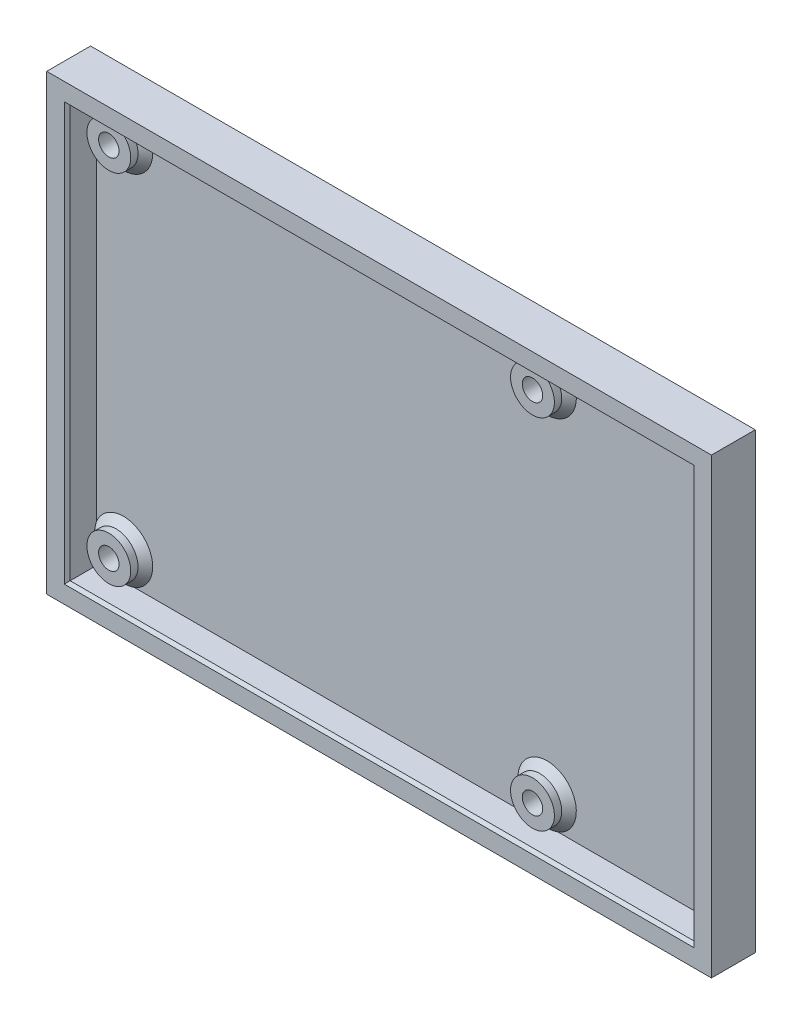
ISO-10303-21;
HEADER;
FILE_DESCRIPTION(('STEP AP214'),'2;1');
FILE_NAME('part.step','',(''),(''),'','','');
FILE_SCHEMA(('AUTOMOTIVE_DESIGN { 1 0 10303 214 1 1 1 1 }'));
ENDSEC;
DATA;
#1=APPLICATION_CONTEXT('core data for automotive mechanical design processes');
#2=APPLICATION_PROTOCOL_DEFINITION('international standard','automotive_design',2000,#1);
#3=PRODUCT_CONTEXT('',#1,'mechanical');
#4=PRODUCT('Part','Part','',(#3));
#5=PRODUCT_RELATED_PRODUCT_CATEGORY('part','',(#4));
#6=PRODUCT_DEFINITION_FORMATION('','',#4);
#7=PRODUCT_DEFINITION_CONTEXT('part definition',#1,'design');
#8=PRODUCT_DEFINITION('design','',#6,#7);
#9=PRODUCT_DEFINITION_SHAPE('','',#8);
#10=(LENGTH_UNIT() NAMED_UNIT(*) SI_UNIT(.MILLI.,.METRE.));
#11=(NAMED_UNIT(*) PLANE_ANGLE_UNIT() SI_UNIT($,.RADIAN.));
#12=(NAMED_UNIT(*) SI_UNIT($,.STERADIAN.) SOLID_ANGLE_UNIT());
#13=UNCERTAINTY_MEASURE_WITH_UNIT(LENGTH_MEASURE(1.E-05),#10,'distance_accuracy_value','');
#14=(GEOMETRIC_REPRESENTATION_CONTEXT(3) GLOBAL_UNCERTAINTY_ASSIGNED_CONTEXT((#13)) GLOBAL_UNIT_ASSIGNED_CONTEXT((#10,
#11,#12)) REPRESENTATION_CONTEXT('',''));
#15=CARTESIAN_POINT('',(0.,0.,0.));
#16=DIRECTION('',(0.,0.,1.));
#17=DIRECTION('',(1.,0.,0.));
#18=AXIS2_PLACEMENT_3D('',#15,#16,#17);
#19=CARTESIAN_POINT('',(0.,0.,2.));
#20=DIRECTION('',(0.,0.,-1.));
#21=DIRECTION('',(-1.,0.,0.));
#22=AXIS2_PLACEMENT_3D('',#19,#20,#21);
#23=PLANE('',#22);
#24=DIRECTION('',(1.,0.,0.));
#25=VECTOR('',#24,1.);
#26=CARTESIAN_POINT('',(-42.7,-28.2,2.));
#27=LINE('',#26,#25);
#28=CARTESIAN_POINT('',(-42.7,-28.2,2.));
#29=VERTEX_POINT('',#28);
#30=CARTESIAN_POINT('',(-40.519868415357,-28.2,2.));
#31=VERTEX_POINT('',#30);
#32=EDGE_CURVE('E174',#29,#31,#27,.T.);
#33=ORIENTED_EDGE('',*,*,#32,.T.);
#34=CARTESIAN_POINT('',(-39.,-24.5,2.));
#35=DIRECTION('',(0.,0.,-1.));
#36=DIRECTION('',(-1.,0.,0.));
#37=AXIS2_PLACEMENT_3D('',#34,#35,#36);
#38=CIRCLE('',#37,3.99999999999999);
#39=CARTESIAN_POINT('',(-42.7,-26.019868415357,2.));
#40=VERTEX_POINT('',#39);
#41=EDGE_CURVE('E290',#31,#40,#38,.T.);
#42=ORIENTED_EDGE('',*,*,#41,.T.);
#43=DIRECTION('',(0.,-1.,0.));
#44=VECTOR('',#43,1.);
#45=CARTESIAN_POINT('',(-42.7,-28.2,2.));
#46=LINE('',#45,#44);
#47=EDGE_CURVE('E184',#40,#29,#46,.T.);
#48=ORIENTED_EDGE('',*,*,#47,.T.);
#49=EDGE_LOOP('',(#33,#42,#48));
#50=FACE_BOUND('',#49,.T.);
#51=ADVANCED_FACE('F45',(#50),#23,.F.);
#52=CARTESIAN_POINT('',(-37.4801315846429,-28.2,2.));
#53=VERTEX_POINT('',#52);
#54=CARTESIAN_POINT('',(17.4801315846429,-28.2,2.));
#55=VERTEX_POINT('',#54);
#56=EDGE_CURVE('E204',#53,#55,#27,.T.);
#57=ORIENTED_EDGE('',*,*,#56,.T.);
#58=CARTESIAN_POINT('',(19.,-24.5,2.));
#59=DIRECTION('',(0.,0.,-1.));
#60=DIRECTION('',(-1.,0.,0.));
#61=AXIS2_PLACEMENT_3D('',#58,#59,#60);
#62=CIRCLE('',#61,4.);
#63=CARTESIAN_POINT('',(20.5198684153571,-28.2,2.));
#64=VERTEX_POINT('',#63);
#65=EDGE_CURVE('E60',#55,#64,#62,.T.);
#66=ORIENTED_EDGE('',*,*,#65,.T.);
#67=CARTESIAN_POINT('',(42.7,-28.2,2.));
#68=VERTEX_POINT('',#67);
#69=EDGE_CURVE('E189',#64,#68,#27,.T.);
#70=ORIENTED_EDGE('',*,*,#69,.T.);
#71=DIRECTION('',(0.,1.,0.));
#72=VECTOR('',#71,1.);
#73=CARTESIAN_POINT('',(42.7,-28.2,2.));
#74=LINE('',#73,#72);
#75=CARTESIAN_POINT('',(42.7,28.2,2.));
#76=VERTEX_POINT('',#75);
#77=EDGE_CURVE('E168',#68,#76,#74,.T.);
#78=ORIENTED_EDGE('',*,*,#77,.T.);
#79=DIRECTION('',(-1.,0.,0.));
#80=VECTOR('',#79,1.);
#81=CARTESIAN_POINT('',(-42.7,28.2,2.));
#82=LINE('',#81,#80);
#83=CARTESIAN_POINT('',(20.5198684153571,28.2,2.));
#84=VERTEX_POINT('',#83);
#85=EDGE_CURVE('E177',#76,#84,#82,.T.);
#86=ORIENTED_EDGE('',*,*,#85,.T.);
#87=CARTESIAN_POINT('',(19.,24.5,2.));
#88=DIRECTION('',(0.,0.,-1.));
#89=DIRECTION('',(-1.,0.,0.));
#90=AXIS2_PLACEMENT_3D('',#87,#88,#89);
#91=CIRCLE('',#90,4.);
#92=CARTESIAN_POINT('',(17.4801315846429,28.2,2.));
#93=VERTEX_POINT('',#92);
#94=EDGE_CURVE('E326',#84,#93,#91,.T.);
#95=ORIENTED_EDGE('',*,*,#94,.T.);
#96=CARTESIAN_POINT('',(-37.4801315846429,28.2,2.));
#97=VERTEX_POINT('',#96);
#98=EDGE_CURVE('E185',#93,#97,#82,.T.);
#99=ORIENTED_EDGE('',*,*,#98,.T.);
#100=CARTESIAN_POINT('',(-39.,24.5,2.));
#101=DIRECTION('',(0.,0.,-1.));
#102=DIRECTION('',(-1.,0.,0.));
#103=AXIS2_PLACEMENT_3D('',#100,#101,#102);
#104=CIRCLE('',#103,3.99999999999999);
#105=CARTESIAN_POINT('',(-42.7,22.980131584643,2.));
#106=VERTEX_POINT('',#105);
#107=EDGE_CURVE('E247',#97,#106,#104,.T.);
#108=ORIENTED_EDGE('',*,*,#107,.T.);
#109=CARTESIAN_POINT('',(-42.7,-22.980131584643,2.));
#110=VERTEX_POINT('',#109);
#111=EDGE_CURVE('E201',#106,#110,#46,.T.);
#112=ORIENTED_EDGE('',*,*,#111,.T.);
#113=CARTESIAN_POINT('',(-39.,-24.5,2.));
#114=DIRECTION('',(0.,0.,-1.));
#115=DIRECTION('',(-1.,0.,0.));
#116=AXIS2_PLACEMENT_3D('',#113,#114,#115);
#117=CIRCLE('',#116,3.99999999999999);
#118=EDGE_CURVE('E365',#110,#53,#117,.T.);
#119=ORIENTED_EDGE('',*,*,#118,.T.);
#120=EDGE_LOOP('',(#57,#66,#70,#78,#86,#95,#99,#108,#112,#119));
#121=FACE_BOUND('',#120,.T.);
#122=ADVANCED_FACE('F188',(#121),#23,.F.);
#123=CARTESIAN_POINT('',(45.5,-31.,6.));
#124=DIRECTION('',(-1.,0.,0.));
#125=DIRECTION('',(0.,0.,1.));
#126=AXIS2_PLACEMENT_3D('',#123,#124,#125);
#127=PLANE('',#126);
#128=DIRECTION('',(0.,1.,0.));
#129=VECTOR('',#128,1.);
#130=CARTESIAN_POINT('',(45.5,-31.,0.));
#131=LINE('',#130,#129);
#132=CARTESIAN_POINT('',(45.5,-31.,0.));
#133=VERTEX_POINT('',#132);
#134=CARTESIAN_POINT('',(45.5,31.,0.));
#135=VERTEX_POINT('',#134);
#136=EDGE_CURVE('E207',#133,#135,#131,.T.);
#137=ORIENTED_EDGE('',*,*,#136,.T.);
#138=DIRECTION('',(0.,0.,-1.));
#139=VECTOR('',#138,1.);
#140=CARTESIAN_POINT('',(45.5,31.,6.));
#141=LINE('',#140,#139);
#142=CARTESIAN_POINT('',(45.5,31.,6.));
#143=VERTEX_POINT('',#142);
#144=EDGE_CURVE('E239',#143,#135,#141,.T.);
#145=ORIENTED_EDGE('',*,*,#144,.F.);
#146=DIRECTION('',(0.,1.,0.));
#147=VECTOR('',#146,1.);
#148=CARTESIAN_POINT('',(45.5,-31.,6.));
#149=LINE('',#148,#147);
#150=CARTESIAN_POINT('',(45.5,-31.,6.));
#151=VERTEX_POINT('',#150);
#152=EDGE_CURVE('E213',#151,#143,#149,.T.);
#153=ORIENTED_EDGE('',*,*,#152,.F.);
#154=DIRECTION('',(0.,0.,-1.));
#155=VECTOR('',#154,1.);
#156=CARTESIAN_POINT('',(45.5,-31.,6.));
#157=LINE('',#156,#155);
#158=EDGE_CURVE('E223',#151,#133,#157,.T.);
#159=ORIENTED_EDGE('',*,*,#158,.T.);
#160=EDGE_LOOP('',(#137,#145,#153,#159));
#161=FACE_BOUND('',#160,.T.);
#162=ADVANCED_FACE('F416',(#161),#127,.F.);
#163=CARTESIAN_POINT('',(-45.5,31.,6.));
#164=DIRECTION('',(0.,-1.,0.));
#165=DIRECTION('',(0.,0.,-1.));
#166=AXIS2_PLACEMENT_3D('',#163,#164,#165);
#167=PLANE('',#166);
#168=DIRECTION('',(-1.,0.,0.));
#169=VECTOR('',#168,1.);
#170=CARTESIAN_POINT('',(-45.5,31.,0.));
#171=LINE('',#170,#169);
#172=CARTESIAN_POINT('',(-45.5,31.,0.));
#173=VERTEX_POINT('',#172);
#174=EDGE_CURVE('E226',#135,#173,#171,.T.);
#175=ORIENTED_EDGE('',*,*,#174,.T.);
#176=DIRECTION('',(0.,0.,-1.));
#177=VECTOR('',#176,1.);
#178=CARTESIAN_POINT('',(-45.5,31.,6.));
#179=LINE('',#178,#177);
#180=CARTESIAN_POINT('',(-45.5,31.,6.));
#181=VERTEX_POINT('',#180);
#182=EDGE_CURVE('E236',#181,#173,#179,.T.);
#183=ORIENTED_EDGE('',*,*,#182,.F.);
#184=DIRECTION('',(-1.,0.,0.));
#185=VECTOR('',#184,1.);
#186=CARTESIAN_POINT('',(-45.5,31.,6.));
#187=LINE('',#186,#185);
#188=EDGE_CURVE('E216',#143,#181,#187,.T.);
#189=ORIENTED_EDGE('',*,*,#188,.F.);
#190=ORIENTED_EDGE('',*,*,#144,.T.);
#191=EDGE_LOOP('',(#175,#183,#189,#190));
#192=FACE_BOUND('',#191,.T.);
#193=ADVANCED_FACE('F419',(#192),#167,.F.);
#194=CARTESIAN_POINT('',(-45.5,-31.,6.));
#195=DIRECTION('',(1.,0.,0.));
#196=DIRECTION('',(0.,0.,-1.));
#197=AXIS2_PLACEMENT_3D('',#194,#195,#196);
#198=PLANE('',#197);
#199=DIRECTION('',(0.,-1.,0.));
#200=VECTOR('',#199,1.);
#201=CARTESIAN_POINT('',(-45.5,-31.,0.));
#202=LINE('',#201,#200);
#203=CARTESIAN_POINT('',(-45.5,-31.,0.));
#204=VERTEX_POINT('',#203);
#205=EDGE_CURVE('E228',#173,#204,#202,.T.);
#206=ORIENTED_EDGE('',*,*,#205,.T.);
#207=DIRECTION('',(0.,0.,-1.));
#208=VECTOR('',#207,1.);
#209=CARTESIAN_POINT('',(-45.5,-31.,6.));
#210=LINE('',#209,#208);
#211=CARTESIAN_POINT('',(-45.5,-31.,6.));
#212=VERTEX_POINT('',#211);
#213=EDGE_CURVE('E233',#212,#204,#210,.T.);
#214=ORIENTED_EDGE('',*,*,#213,.F.);
#215=DIRECTION('',(0.,-1.,0.));
#216=VECTOR('',#215,1.);
#217=CARTESIAN_POINT('',(-45.5,-31.,6.));
#218=LINE('',#217,#216);
#219=EDGE_CURVE('E219',#181,#212,#218,.T.);
#220=ORIENTED_EDGE('',*,*,#219,.F.);
#221=ORIENTED_EDGE('',*,*,#182,.T.);
#222=EDGE_LOOP('',(#206,#214,#220,#221));
#223=FACE_BOUND('',#222,.T.);
#224=ADVANCED_FACE('F424',(#223),#198,.F.);
#225=CARTESIAN_POINT('',(-45.5,-31.,6.));
#226=DIRECTION('',(0.,1.,0.));
#227=DIRECTION('',(0.,0.,1.));
#228=AXIS2_PLACEMENT_3D('',#225,#226,#227);
#229=PLANE('',#228);
#230=DIRECTION('',(1.,0.,0.));
#231=VECTOR('',#230,1.);
#232=CARTESIAN_POINT('',(-45.5,-31.,0.));
#233=LINE('',#232,#231);
#234=EDGE_CURVE('E217',#204,#133,#233,.T.);
#235=ORIENTED_EDGE('',*,*,#234,.T.);
#236=ORIENTED_EDGE('',*,*,#158,.F.);
#237=DIRECTION('',(1.,0.,0.));
#238=VECTOR('',#237,1.);
#239=CARTESIAN_POINT('',(-45.5,-31.,6.));
#240=LINE('',#239,#238);
#241=EDGE_CURVE('E221',#212,#151,#240,.T.);
#242=ORIENTED_EDGE('',*,*,#241,.F.);
#243=ORIENTED_EDGE('',*,*,#213,.T.);
#244=EDGE_LOOP('',(#235,#236,#242,#243));
#245=FACE_BOUND('',#244,.T.);
#246=ADVANCED_FACE('F408',(#245),#229,.F.);
#247=CARTESIAN_POINT('',(0.,0.,6.));
#248=DIRECTION('',(0.,0.,-1.));
#249=DIRECTION('',(-1.,0.,0.));
#250=AXIS2_PLACEMENT_3D('',#247,#248,#249);
#251=PLANE('',#250);
#252=DIRECTION('',(0.,-1.,0.));
#253=VECTOR('',#252,1.);
#254=CARTESIAN_POINT('',(43.1,0.,6.));
#255=LINE('',#254,#253);
#256=CARTESIAN_POINT('',(43.1,28.6,6.));
#257=VERTEX_POINT('',#256);
#258=CARTESIAN_POINT('',(43.1,-28.6,6.));
#259=VERTEX_POINT('',#258);
#260=EDGE_CURVE('E341',#257,#259,#255,.T.);
#261=ORIENTED_EDGE('',*,*,#260,.T.);
#262=DIRECTION('',(-1.,0.,0.));
#263=VECTOR('',#262,1.);
#264=CARTESIAN_POINT('',(0.,-28.6,6.));
#265=LINE('',#264,#263);
#266=CARTESIAN_POINT('',(-43.1,-28.6,6.));
#267=VERTEX_POINT('',#266);
#268=EDGE_CURVE('E343',#259,#267,#265,.T.);
#269=ORIENTED_EDGE('',*,*,#268,.T.);
#270=DIRECTION('',(0.,1.,0.));
#271=VECTOR('',#270,1.);
#272=CARTESIAN_POINT('',(-43.1,0.,6.));
#273=LINE('',#272,#271);
#274=CARTESIAN_POINT('',(-43.1,28.6,6.));
#275=VERTEX_POINT('',#274);
#276=EDGE_CURVE('E336',#267,#275,#273,.T.);
#277=ORIENTED_EDGE('',*,*,#276,.T.);
#278=DIRECTION('',(1.,0.,0.));
#279=VECTOR('',#278,1.);
#280=CARTESIAN_POINT('',(0.,28.6,6.));
#281=LINE('',#280,#279);
#282=EDGE_CURVE('E335',#275,#257,#281,.T.);
#283=ORIENTED_EDGE('',*,*,#282,.T.);
#284=EDGE_LOOP('',(#261,#269,#277,#283));
#285=FACE_BOUND('',#284,.T.);
#286=ORIENTED_EDGE('',*,*,#152,.T.);
#287=ORIENTED_EDGE('',*,*,#188,.T.);
#288=ORIENTED_EDGE('',*,*,#219,.T.);
#289=ORIENTED_EDGE('',*,*,#241,.T.);
#290=EDGE_LOOP('',(#286,#287,#288,#289));
#291=FACE_BOUND('',#290,.T.);
#292=ADVANCED_FACE('F404',(#285,#291),#251,.F.);
#293=CARTESIAN_POINT('',(0.,0.,0.));
#294=DIRECTION('',(0.,0.,-1.));
#295=DIRECTION('',(-1.,0.,0.));
#296=AXIS2_PLACEMENT_3D('',#293,#294,#295);
#297=PLANE('',#296);
#298=ORIENTED_EDGE('',*,*,#136,.F.);
#299=ORIENTED_EDGE('',*,*,#234,.F.);
#300=ORIENTED_EDGE('',*,*,#205,.F.);
#301=ORIENTED_EDGE('',*,*,#174,.F.);
#302=EDGE_LOOP('',(#298,#299,#300,#301));
#303=FACE_BOUND('',#302,.T.);
#304=ADVANCED_FACE('F407',(#303),#297,.T.);
#305=CARTESIAN_POINT('',(42.7,-28.2,2.));
#306=DIRECTION('',(1.,0.,0.));
#307=DIRECTION('',(0.,0.,-1.));
#308=AXIS2_PLACEMENT_3D('',#305,#306,#307);
#309=PLANE('',#308);
#310=DIRECTION('',(0.,0.,1.));
#311=VECTOR('',#310,1.);
#312=CARTESIAN_POINT('',(42.7,-28.2,2.));
#313=LINE('',#312,#311);
#314=CARTESIAN_POINT('',(42.7,-28.2,5.59999999999999));
#315=VERTEX_POINT('',#314);
#316=EDGE_CURVE('E205',#68,#315,#313,.T.);
#317=ORIENTED_EDGE('',*,*,#316,.T.);
#318=DIRECTION('',(0.,1.,0.));
#319=VECTOR('',#318,1.);
#320=CARTESIAN_POINT('',(42.7,-28.2,5.59999999999999));
#321=LINE('',#320,#319);
#322=CARTESIAN_POINT('',(42.7,28.2,5.59999999999999));
#323=VERTEX_POINT('',#322);
#324=EDGE_CURVE('E170',#315,#323,#321,.T.);
#325=ORIENTED_EDGE('',*,*,#324,.T.);
#326=DIRECTION('',(0.,0.,1.));
#327=VECTOR('',#326,1.);
#328=CARTESIAN_POINT('',(42.7,28.2,2.));
#329=LINE('',#328,#327);
#330=EDGE_CURVE('E163',#76,#323,#329,.T.);
#331=ORIENTED_EDGE('',*,*,#330,.F.);
#332=ORIENTED_EDGE('',*,*,#77,.F.);
#333=EDGE_LOOP('',(#317,#325,#331,#332));
#334=FACE_BOUND('',#333,.T.);
#335=ADVANCED_FACE('F166',(#334),#309,.F.);
#336=CARTESIAN_POINT('',(-42.7,-28.2,2.));
#337=DIRECTION('',(0.,-1.,0.));
#338=DIRECTION('',(0.,0.,-1.));
#339=AXIS2_PLACEMENT_3D('',#336,#337,#338);
#340=PLANE('',#339);
#341=ORIENTED_EDGE('',*,*,#69,.F.);
#342=CARTESIAN_POINT('',(20.5198684153571,-28.2,2.));
#343=CARTESIAN_POINT('',(20.3996159975398,-28.2,2.0457209328995));
#344=CARTESIAN_POINT('',(20.2776757720313,-28.2,2.0873905536171));
#345=CARTESIAN_POINT('',(20.0305523132339,-28.2,2.16096980399327));
#346=CARTESIAN_POINT('',(19.9053612967029,-28.2,2.19285310163561));
#347=CARTESIAN_POINT('',(19.6570616577513,-28.2,2.24400302894858));
#348=CARTESIAN_POINT('',(19.5340400474862,-28.2,2.26368213671217));
#349=CARTESIAN_POINT('',(19.2868064375951,-28.2,2.29093077519485));
#350=CARTESIAN_POINT('',(19.1625962210789,-28.2,2.29851623591507));
#351=CARTESIAN_POINT('',(18.9078964698552,-28.2,2.30115048282994));
#352=CARTESIAN_POINT('',(18.7773997783291,-28.2,2.29556161490789));
#353=CARTESIAN_POINT('',(18.5175153604042,-28.2,2.27092343199823));
#354=CARTESIAN_POINT('',(18.3881295541147,-28.2,2.25185427074664));
#355=CARTESIAN_POINT('',(18.126789293958,-28.2,2.20060033582289));
#356=CARTESIAN_POINT('',(17.9949322395612,-28.2,2.1679318528328));
#357=CARTESIAN_POINT('',(17.7348049835193,-28.2,2.09164868380416));
#358=CARTESIAN_POINT('',(17.6065256343973,-28.2,2.04806544391446));
#359=CARTESIAN_POINT('',(17.4801315846429,-28.2,2.));
#360=B_SPLINE_CURVE_WITH_KNOTS('',3,(#342,#343,#344,#345,#346,#347,#348,#349,#350,#351,#352,
#353,#354,#355,#356,#357,#358,#359),.UNSPECIFIED.,.F.,.F.,(4,2,2,2,2,2,2,2,4),(0.,
0.386088644021028,0.773207208026572,1.14640454998035,1.51910990134929,1.91022216014625,
2.30191143356873,2.70891717268715,3.11476352601566),.UNSPECIFIED.);
#361=EDGE_CURVE('E11',#64,#55,#360,.T.);
#362=ORIENTED_EDGE('',*,*,#361,.T.);
#363=ORIENTED_EDGE('',*,*,#56,.F.);
#364=CARTESIAN_POINT('',(-37.4801315846429,-28.2,2.));
#365=CARTESIAN_POINT('',(-37.6003840024602,-28.2,2.0457209328995));
#366=CARTESIAN_POINT('',(-37.7223242279688,-28.2,2.0873905536171));
#367=CARTESIAN_POINT('',(-37.9694476867661,-28.2,2.16096980399327));
#368=CARTESIAN_POINT('',(-38.0946387032972,-28.2,2.19285310163561));
#369=CARTESIAN_POINT('',(-38.3429383422487,-28.2,2.24400302894857));
#370=CARTESIAN_POINT('',(-38.4659599525138,-28.2,2.26368213671215));
#371=CARTESIAN_POINT('',(-38.7131935624049,-28.2,2.29093077519483));
#372=CARTESIAN_POINT('',(-38.8374037789212,-28.2,2.29851623591505));
#373=CARTESIAN_POINT('',(-39.0921035301448,-28.2,2.30115048282992));
#374=CARTESIAN_POINT('',(-39.2226002216709,-28.2,2.29556161490787));
#375=CARTESIAN_POINT('',(-39.4824846395958,-28.2,2.27092343199821));
#376=CARTESIAN_POINT('',(-39.6118704458853,-28.2,2.25185427074662));
#377=CARTESIAN_POINT('',(-39.873210706042,-28.2,2.20060033582287));
#378=CARTESIAN_POINT('',(-40.0050677604387,-28.2,2.16793185283279));
#379=CARTESIAN_POINT('',(-40.2651950164807,-28.2,2.09164868380415));
#380=CARTESIAN_POINT('',(-40.3934743656027,-28.2,2.04806544391446));
#381=CARTESIAN_POINT('',(-40.519868415357,-28.2,2.));
#382=B_SPLINE_CURVE_WITH_KNOTS('',3,(#364,#365,#366,#367,#368,#369,#370,#371,#372,#373,#374,
#375,#376,#377,#378,#379,#380,#381),.UNSPECIFIED.,.F.,.F.,(4,2,2,2,2,2,2,2,4),(0.,
0.386088644021026,0.773207208026569,1.14640454998036,1.51910990134928,1.91022216014623,
2.30191143356869,2.70891717268708,3.11476352601558),.UNSPECIFIED.);
#383=EDGE_CURVE('E289',#53,#31,#382,.T.);
#384=ORIENTED_EDGE('',*,*,#383,.T.);
#385=ORIENTED_EDGE('',*,*,#32,.F.);
#386=DIRECTION('',(0.,0.,1.));
#387=VECTOR('',#386,1.);
#388=CARTESIAN_POINT('',(-42.7,-28.2,2.));
#389=LINE('',#388,#387);
#390=CARTESIAN_POINT('',(-42.7,-28.2,5.59999999999999));
#391=VERTEX_POINT('',#390);
#392=EDGE_CURVE('E208',#29,#391,#389,.T.);
#393=ORIENTED_EDGE('',*,*,#392,.T.);
#394=DIRECTION('',(1.,0.,0.));
#395=VECTOR('',#394,1.);
#396=CARTESIAN_POINT('',(-42.7,-28.2,5.59999999999999));
#397=LINE('',#396,#395);
#398=EDGE_CURVE('E330',#391,#315,#397,.T.);
#399=ORIENTED_EDGE('',*,*,#398,.T.);
#400=ORIENTED_EDGE('',*,*,#316,.F.);
#401=EDGE_LOOP('',(#341,#362,#363,#384,#385,#393,#399,#400));
#402=FACE_BOUND('',#401,.T.);
#403=ADVANCED_FACE('F273',(#402),#340,.F.);
#404=CARTESIAN_POINT('',(-42.7,-28.2,2.));
#405=DIRECTION('',(-1.,0.,0.));
#406=DIRECTION('',(0.,0.,1.));
#407=AXIS2_PLACEMENT_3D('',#404,#405,#406);
#408=PLANE('',#407);
#409=ORIENTED_EDGE('',*,*,#47,.F.);
#410=CARTESIAN_POINT('',(-42.7,-26.019868415357,2.));
#411=CARTESIAN_POINT('',(-42.7,-25.8996159975397,2.0457209328995));
#412=CARTESIAN_POINT('',(-42.7,-25.7776757720312,2.08739055361709));
#413=CARTESIAN_POINT('',(-42.7,-25.5305523132338,2.16096980399326));
#414=CARTESIAN_POINT('',(-42.7,-25.4053612967028,2.1928531016356));
#415=CARTESIAN_POINT('',(-42.7,-25.1570616577512,2.24400302894857));
#416=CARTESIAN_POINT('',(-42.7,-25.0340400474861,2.26368213671214));
#417=CARTESIAN_POINT('',(-42.7,-24.786806437595,2.29093077519482));
#418=CARTESIAN_POINT('',(-42.7,-24.6625962210788,2.29851623591504));
#419=CARTESIAN_POINT('',(-42.7,-24.4078964698551,2.30115048282991));
#420=CARTESIAN_POINT('',(-42.7,-24.2773997783291,2.29556161490786));
#421=CARTESIAN_POINT('',(-42.7,-24.0175153604042,2.2709234319982));
#422=CARTESIAN_POINT('',(-42.7,-23.8881295541147,2.2518542707466));
#423=CARTESIAN_POINT('',(-42.7,-23.626789293958,2.20060033582286));
#424=CARTESIAN_POINT('',(-42.7,-23.4949322395612,2.16793185283278));
#425=CARTESIAN_POINT('',(-42.7,-23.2348049835193,2.09164868380414));
#426=CARTESIAN_POINT('',(-42.7,-23.1065256343973,2.04806544391445));
#427=CARTESIAN_POINT('',(-42.7,-22.980131584643,2.));
#428=B_SPLINE_CURVE_WITH_KNOTS('',3,(#410,#411,#412,#413,#414,#415,#416,#417,#418,#419,#420,
#421,#422,#423,#424,#425,#426,#427),.UNSPECIFIED.,.F.,.F.,(4,2,2,2,2,2,2,2,4),(0.,
0.386088644021022,0.77320720802656,1.14640454998034,1.51910990134927,1.91022216014621,
2.30191143356864,2.70891717268703,3.1147635260155),.UNSPECIFIED.);
#429=EDGE_CURVE('E281',#40,#110,#428,.T.);
#430=ORIENTED_EDGE('',*,*,#429,.T.);
#431=ORIENTED_EDGE('',*,*,#111,.F.);
#432=CARTESIAN_POINT('',(-42.7,22.980131584643,2.));
#433=CARTESIAN_POINT('',(-42.7,23.1003840024603,2.0457209328995));
#434=CARTESIAN_POINT('',(-42.7,23.2223242279688,2.08739055361709));
#435=CARTESIAN_POINT('',(-42.7,23.4694476867662,2.16096980399326));
#436=CARTESIAN_POINT('',(-42.7,23.5946387032972,2.1928531016356));
#437=CARTESIAN_POINT('',(-42.7,23.8429383422488,2.24400302894857));
#438=CARTESIAN_POINT('',(-42.7,23.9659599525139,2.26368213671214));
#439=CARTESIAN_POINT('',(-42.7,24.213193562405,2.29093077519482));
#440=CARTESIAN_POINT('',(-42.7,24.3374037789212,2.29851623591504));
#441=CARTESIAN_POINT('',(-42.7,24.5921035301449,2.30115048282991));
#442=CARTESIAN_POINT('',(-42.7,24.7226002216709,2.29556161490786));
#443=CARTESIAN_POINT('',(-42.7,24.9824846395958,2.2709234319982));
#444=CARTESIAN_POINT('',(-42.7,25.1118704458853,2.2518542707466));
#445=CARTESIAN_POINT('',(-42.7,25.373210706042,2.20060033582286));
#446=CARTESIAN_POINT('',(-42.7,25.5050677604388,2.16793185283278));
#447=CARTESIAN_POINT('',(-42.7,25.7651950164807,2.09164868380415));
#448=CARTESIAN_POINT('',(-42.7,25.8934743656027,2.04806544391445));
#449=CARTESIAN_POINT('',(-42.7,26.019868415357,2.));
#450=B_SPLINE_CURVE_WITH_KNOTS('',3,(#432,#433,#434,#435,#436,#437,#438,#439,#440,#441,#442,
#443,#444,#445,#446,#447,#448,#449),.UNSPECIFIED.,.F.,.F.,(4,2,2,2,2,2,2,2,4),(0.,
0.386088644021022,0.77320720802656,1.14640454998034,1.51910990134927,1.91022216014621,
2.30191143356864,2.70891717268702,3.1147635260155),.UNSPECIFIED.);
#451=CARTESIAN_POINT('',(-42.7,26.019868415357,2.));
#452=VERTEX_POINT('',#451);
#453=EDGE_CURVE('E250',#106,#452,#450,.T.);
#454=ORIENTED_EDGE('',*,*,#453,.T.);
#455=CARTESIAN_POINT('',(-42.7,28.2,2.));
#456=VERTEX_POINT('',#455);
#457=EDGE_CURVE('E198',#456,#452,#46,.T.);
#458=ORIENTED_EDGE('',*,*,#457,.F.);
#459=DIRECTION('',(0.,0.,1.));
#460=VECTOR('',#459,1.);
#461=CARTESIAN_POINT('',(-42.7,28.2,2.));
#462=LINE('',#461,#460);
#463=CARTESIAN_POINT('',(-42.7,28.2,5.59999999999999));
#464=VERTEX_POINT('',#463);
#465=EDGE_CURVE('E173',#456,#464,#462,.T.);
#466=ORIENTED_EDGE('',*,*,#465,.T.);
#467=DIRECTION('',(0.,-1.,0.));
#468=VECTOR('',#467,1.);
#469=CARTESIAN_POINT('',(-42.7,-28.2,5.59999999999999));
#470=LINE('',#469,#468);
#471=EDGE_CURVE('E347',#464,#391,#470,.T.);
#472=ORIENTED_EDGE('',*,*,#471,.T.);
#473=ORIENTED_EDGE('',*,*,#392,.F.);
#474=EDGE_LOOP('',(#409,#430,#431,#454,#458,#466,#472,#473));
#475=FACE_BOUND('',#474,.T.);
#476=ADVANCED_FACE('F270',(#475),#408,.F.);
#477=CARTESIAN_POINT('',(-42.7,28.2,2.));
#478=DIRECTION('',(0.,1.,0.));
#479=DIRECTION('',(0.,0.,1.));
#480=AXIS2_PLACEMENT_3D('',#477,#478,#479);
#481=PLANE('',#480);
#482=ORIENTED_EDGE('',*,*,#98,.F.);
#483=CARTESIAN_POINT('',(17.480131584643,28.2,2.));
#484=CARTESIAN_POINT('',(17.6003840024602,28.2,2.0457209328995));
#485=CARTESIAN_POINT('',(17.7223242279688,28.2,2.0873905536171));
#486=CARTESIAN_POINT('',(17.9694476867662,28.2,2.16096980399327));
#487=CARTESIAN_POINT('',(18.0946387032972,28.2,2.19285310163561));
#488=CARTESIAN_POINT('',(18.3429383422487,28.2,2.24400302894858));
#489=CARTESIAN_POINT('',(18.4659599525138,28.2,2.26368213671216));
#490=CARTESIAN_POINT('',(18.713193562405,28.2,2.29093077519484));
#491=CARTESIAN_POINT('',(18.8374037789212,28.2,2.29851623591506));
#492=CARTESIAN_POINT('',(19.0921035301448,28.2,2.30115048282993));
#493=CARTESIAN_POINT('',(19.2226002216709,28.2,2.29556161490788));
#494=CARTESIAN_POINT('',(19.4824846395958,28.2,2.27092343199822));
#495=CARTESIAN_POINT('',(19.6118704458854,28.2,2.25185427074663));
#496=CARTESIAN_POINT('',(19.873210706042,28.2,2.20060033582288));
#497=CARTESIAN_POINT('',(20.0050677604388,28.2,2.1679318528328));
#498=CARTESIAN_POINT('',(20.2651950164808,28.2,2.09164868380415));
#499=CARTESIAN_POINT('',(20.3934743656028,28.2,2.04806544391446));
#500=CARTESIAN_POINT('',(20.5198684153571,28.2,2.));
#501=B_SPLINE_CURVE_WITH_KNOTS('',3,(#483,#484,#485,#486,#487,#488,#489,#490,#491,#492,#493,
#494,#495,#496,#497,#498,#499,#500),.UNSPECIFIED.,.F.,.F.,(4,2,2,2,2,2,2,2,4),(0.,
0.386088644021028,0.773207208026567,1.14640454998035,1.51910990134928,1.91022216014624,
2.3019114335687,2.70891717268712,3.11476352601562),.UNSPECIFIED.);
#502=EDGE_CURVE('E180',#93,#84,#501,.T.);
#503=ORIENTED_EDGE('',*,*,#502,.T.);
#504=ORIENTED_EDGE('',*,*,#85,.F.);
#505=ORIENTED_EDGE('',*,*,#330,.T.);
#506=DIRECTION('',(-1.,0.,0.));
#507=VECTOR('',#506,1.);
#508=CARTESIAN_POINT('',(-42.7,28.2,5.59999999999999));
#509=LINE('',#508,#507);
#510=EDGE_CURVE('E349',#323,#464,#509,.T.);
#511=ORIENTED_EDGE('',*,*,#510,.T.);
#512=ORIENTED_EDGE('',*,*,#465,.F.);
#513=CARTESIAN_POINT('',(-40.519868415357,28.2,2.));
#514=VERTEX_POINT('',#513);
#515=EDGE_CURVE('E187',#514,#456,#82,.T.);
#516=ORIENTED_EDGE('',*,*,#515,.F.);
#517=CARTESIAN_POINT('',(-40.519868415357,28.2,2.));
#518=CARTESIAN_POINT('',(-40.3996159975397,28.2,2.0457209328995));
#519=CARTESIAN_POINT('',(-40.2776757720312,28.2,2.08739055361709));
#520=CARTESIAN_POINT('',(-40.0305523132338,28.2,2.16096980399326));
#521=CARTESIAN_POINT('',(-39.9053612967028,28.2,2.1928531016356));
#522=CARTESIAN_POINT('',(-39.6570616577512,28.2,2.24400302894857));
#523=CARTESIAN_POINT('',(-39.5340400474861,28.2,2.26368213671215));
#524=CARTESIAN_POINT('',(-39.286806437595,28.2,2.29093077519482));
#525=CARTESIAN_POINT('',(-39.1625962210788,28.2,2.29851623591505));
#526=CARTESIAN_POINT('',(-38.9078964698551,28.2,2.30115048282991));
#527=CARTESIAN_POINT('',(-38.777399778329,28.2,2.29556161490786));
#528=CARTESIAN_POINT('',(-38.5175153604042,28.2,2.2709234319982));
#529=CARTESIAN_POINT('',(-38.3881295541146,28.2,2.25185427074661));
#530=CARTESIAN_POINT('',(-38.126789293958,28.2,2.20060033582287));
#531=CARTESIAN_POINT('',(-37.9949322395612,28.2,2.16793185283278));
#532=CARTESIAN_POINT('',(-37.7348049835192,28.2,2.09164868380415));
#533=CARTESIAN_POINT('',(-37.6065256343973,28.2,2.04806544391445));
#534=CARTESIAN_POINT('',(-37.4801315846429,28.2,2.));
#535=B_SPLINE_CURVE_WITH_KNOTS('',3,(#517,#518,#519,#520,#521,#522,#523,#524,#525,#526,#527,
#528,#529,#530,#531,#532,#533,#534),.UNSPECIFIED.,.F.,.F.,(4,2,2,2,2,2,2,2,4),(0.,
0.386088644021019,0.773207208026561,1.14640454998035,1.51910990134927,1.91022216014622,
2.30191143356867,2.70891717268706,3.11476352601554),.UNSPECIFIED.);
#536=EDGE_CURVE('E258',#514,#97,#535,.T.);
#537=ORIENTED_EDGE('',*,*,#536,.T.);
#538=EDGE_LOOP('',(#482,#503,#504,#505,#511,#512,#516,#537));
#539=FACE_BOUND('',#538,.T.);
#540=ADVANCED_FACE('F179',(#539),#481,.F.);
#541=ORIENTED_EDGE('',*,*,#457,.T.);
#542=CARTESIAN_POINT('',(-39.,24.5,2.));
#543=DIRECTION('',(0.,0.,-1.));
#544=DIRECTION('',(-1.,0.,0.));
#545=AXIS2_PLACEMENT_3D('',#542,#543,#544);
#546=CIRCLE('',#545,3.99999999999999);
#547=EDGE_CURVE('E245',#452,#514,#546,.T.);
#548=ORIENTED_EDGE('',*,*,#547,.T.);
#549=ORIENTED_EDGE('',*,*,#515,.T.);
#550=EDGE_LOOP('',(#541,#548,#549));
#551=FACE_BOUND('',#550,.T.);
#552=ADVANCED_FACE('F388',(#551),#23,.F.);
#553=CARTESIAN_POINT('',(-39.,24.5,4.));
#554=DIRECTION('',(0.,0.,1.));
#555=DIRECTION('',(1.,0.,0.));
#556=AXIS2_PLACEMENT_3D('',#553,#554,#555);
#557=PLANE('',#556);
#558=CARTESIAN_POINT('',(-39.,24.5,4.));
#559=DIRECTION('',(0.,0.,1.));
#560=DIRECTION('',(1.,0.,0.));
#561=AXIS2_PLACEMENT_3D('',#558,#559,#560);
#562=CIRCLE('',#561,3.);
#563=CARTESIAN_POINT('',(-36.,24.5,4.));
#564=VERTEX_POINT('',#563);
#565=EDGE_CURVE('E191',#564,#564,#562,.T.);
#566=ORIENTED_EDGE('',*,*,#565,.T.);
#567=EDGE_LOOP('',(#566));
#568=FACE_BOUND('',#567,.T.);
#569=CARTESIAN_POINT('',(-39.,24.5,4.));
#570=DIRECTION('',(0.,0.,1.));
#571=DIRECTION('',(1.,0.,0.));
#572=AXIS2_PLACEMENT_3D('',#569,#570,#571);
#573=CIRCLE('',#572,1.4);
#574=CARTESIAN_POINT('',(-37.6,24.5,4.));
#575=VERTEX_POINT('',#574);
#576=EDGE_CURVE('E194',#575,#575,#573,.T.);
#577=ORIENTED_EDGE('',*,*,#576,.F.);
#578=EDGE_LOOP('',(#577));
#579=FACE_BOUND('',#578,.T.);
#580=ADVANCED_FACE('F449',(#568,#579),#557,.T.);
#581=CARTESIAN_POINT('',(-39.,24.5,4.));
#582=DIRECTION('',(0.,0.,-1.));
#583=DIRECTION('',(-1.,0.,0.));
#584=AXIS2_PLACEMENT_3D('',#581,#582,#583);
#585=CYLINDRICAL_SURFACE('',#584,3.);
#586=CARTESIAN_POINT('',(-39.,24.5,3.));
#587=DIRECTION('',(0.,0.,-1.));
#588=DIRECTION('',(-1.,0.,0.));
#589=AXIS2_PLACEMENT_3D('',#586,#587,#588);
#590=CIRCLE('',#589,3.);
#591=CARTESIAN_POINT('',(-42.,24.5,3.));
#592=VERTEX_POINT('',#591);
#593=EDGE_CURVE('E242',#592,#592,#590,.F.);
#594=ORIENTED_EDGE('',*,*,#593,.T.);
#595=EDGE_LOOP('',(#594));
#596=FACE_BOUND('',#595,.T.);
#597=ORIENTED_EDGE('',*,*,#565,.F.);
#598=EDGE_LOOP('',(#597));
#599=FACE_BOUND('',#598,.T.);
#600=ADVANCED_FACE('F454',(#596,#599),#585,.T.);
#601=CARTESIAN_POINT('',(-39.,24.5,4.));
#602=DIRECTION('',(0.,0.,-1.));
#603=DIRECTION('',(-1.,0.,0.));
#604=AXIS2_PLACEMENT_3D('',#601,#602,#603);
#605=CYLINDRICAL_SURFACE('',#604,1.4);
#606=ORIENTED_EDGE('',*,*,#576,.T.);
#607=EDGE_LOOP('',(#606));
#608=FACE_BOUND('',#607,.T.);
#609=CARTESIAN_POINT('',(-39.,24.5,2.));
#610=DIRECTION('',(0.,0.,1.));
#611=DIRECTION('',(1.,0.,0.));
#612=AXIS2_PLACEMENT_3D('',#609,#610,#611);
#613=CIRCLE('',#612,1.4);
#614=CARTESIAN_POINT('',(-37.6,24.5,2.));
#615=VERTEX_POINT('',#614);
#616=EDGE_CURVE('E363',#615,#615,#613,.T.);
#617=ORIENTED_EDGE('',*,*,#616,.F.);
#618=EDGE_LOOP('',(#617));
#619=FACE_BOUND('',#618,.T.);
#620=ADVANCED_FACE('F458',(#608,#619),#605,.F.);
#621=ORIENTED_EDGE('',*,*,#616,.T.);
#622=EDGE_LOOP('',(#621));
#623=FACE_BOUND('',#622,.T.);
#624=ADVANCED_FACE('F441',(#623),#23,.F.);
#625=CARTESIAN_POINT('',(-39.,24.5,3.));
#626=DIRECTION('',(0.,0.,-1.));
#627=DIRECTION('',(-1.,0.,0.));
#628=AXIS2_PLACEMENT_3D('',#625,#626,#627);
#629=CONICAL_SURFACE('',#628,3.,0.785398163397443);
#630=ORIENTED_EDGE('',*,*,#453,.F.);
#631=ORIENTED_EDGE('',*,*,#107,.F.);
#632=ORIENTED_EDGE('',*,*,#536,.F.);
#633=ORIENTED_EDGE('',*,*,#547,.F.);
#634=EDGE_LOOP('',(#630,#631,#632,#633));
#635=FACE_BOUND('',#634,.T.);
#636=ORIENTED_EDGE('',*,*,#593,.F.);
#637=EDGE_LOOP('',(#636));
#638=FACE_BOUND('',#637,.T.);
#639=ADVANCED_FACE('F266',(#635,#638),#629,.T.);
#640=CARTESIAN_POINT('',(-42.7,28.2,5.59999999999999));
#641=DIRECTION('',(0.,0.707106781186548,-0.707106781186548));
#642=DIRECTION('',(-1.,0.,0.));
#643=AXIS2_PLACEMENT_3D('',#640,#641,#642);
#644=PLANE('',#643);
#645=DIRECTION('',(0.577350269189626,0.577350269189626,0.577350269189626));
#646=VECTOR('',#645,1.);
#647=CARTESIAN_POINT('',(23.9,9.39999999999999,-13.2));
#648=LINE('',#647,#646);
#649=EDGE_CURVE('E357',#257,#323,#648,.F.);
#650=ORIENTED_EDGE('',*,*,#649,.F.);
#651=ORIENTED_EDGE('',*,*,#282,.F.);
#652=DIRECTION('',(0.577350269189626,-0.577350269189626,-0.577350269189626));
#653=VECTOR('',#652,1.);
#654=CARTESIAN_POINT('',(-23.9,9.39999999999999,-13.2));
#655=LINE('',#654,#653);
#656=EDGE_CURVE('E360',#464,#275,#655,.F.);
#657=ORIENTED_EDGE('',*,*,#656,.F.);
#658=ORIENTED_EDGE('',*,*,#510,.F.);
#659=EDGE_LOOP('',(#650,#651,#657,#658));
#660=FACE_BOUND('',#659,.T.);
#661=ADVANCED_FACE('F310',(#660),#644,.F.);
#662=CARTESIAN_POINT('',(-42.7,-28.2,5.59999999999999));
#663=DIRECTION('',(-0.707106781186548,0.,-0.707106781186548));
#664=DIRECTION('',(0.,-1.,0.));
#665=AXIS2_PLACEMENT_3D('',#662,#663,#664);
#666=PLANE('',#665);
#667=ORIENTED_EDGE('',*,*,#656,.T.);
#668=ORIENTED_EDGE('',*,*,#276,.F.);
#669=DIRECTION('',(0.577350269189626,0.577350269189626,-0.577350269189626));
#670=VECTOR('',#669,1.);
#671=CARTESIAN_POINT('',(-42.7,-28.2,5.59999999999999));
#672=LINE('',#671,#670);
#673=EDGE_CURVE('E354',#391,#267,#672,.F.);
#674=ORIENTED_EDGE('',*,*,#673,.F.);
#675=ORIENTED_EDGE('',*,*,#471,.F.);
#676=EDGE_LOOP('',(#667,#668,#674,#675));
#677=FACE_BOUND('',#676,.T.);
#678=ADVANCED_FACE('F396',(#677),#666,.F.);
#679=CARTESIAN_POINT('',(42.7,-28.2,5.59999999999999));
#680=DIRECTION('',(0.707106781186548,0.,-0.707106781186548));
#681=DIRECTION('',(0.,1.,0.));
#682=AXIS2_PLACEMENT_3D('',#679,#680,#681);
#683=PLANE('',#682);
#684=ORIENTED_EDGE('',*,*,#649,.T.);
#685=ORIENTED_EDGE('',*,*,#324,.F.);
#686=DIRECTION('',(0.577350269189626,-0.577350269189626,0.577350269189626));
#687=VECTOR('',#686,1.);
#688=CARTESIAN_POINT('',(14.2333333333333,0.266666666666668,-22.8666666666667));
#689=LINE('',#688,#687);
#690=EDGE_CURVE('E352',#259,#315,#689,.F.);
#691=ORIENTED_EDGE('',*,*,#690,.F.);
#692=ORIENTED_EDGE('',*,*,#260,.F.);
#693=EDGE_LOOP('',(#684,#685,#691,#692));
#694=FACE_BOUND('',#693,.T.);
#695=ADVANCED_FACE('F403',(#694),#683,.F.);
#696=CARTESIAN_POINT('',(-42.7,-28.2,5.59999999999999));
#697=DIRECTION('',(0.,-0.707106781186548,-0.707106781186548));
#698=DIRECTION('',(1.,0.,0.));
#699=AXIS2_PLACEMENT_3D('',#696,#697,#698);
#700=PLANE('',#699);
#701=ORIENTED_EDGE('',*,*,#673,.T.);
#702=ORIENTED_EDGE('',*,*,#268,.F.);
#703=ORIENTED_EDGE('',*,*,#690,.T.);
#704=ORIENTED_EDGE('',*,*,#398,.F.);
#705=EDGE_LOOP('',(#701,#702,#703,#704));
#706=FACE_BOUND('',#705,.T.);
#707=ADVANCED_FACE('F398',(#706),#700,.F.);
#708=CARTESIAN_POINT('',(-39.,-24.5,4.));
#709=DIRECTION('',(0.,0.,1.));
#710=DIRECTION('',(1.,0.,0.));
#711=AXIS2_PLACEMENT_3D('',#708,#709,#710);
#712=PLANE('',#711);
#713=CARTESIAN_POINT('',(-39.,-24.5,4.));
#714=DIRECTION('',(0.,0.,1.));
#715=DIRECTION('',(1.,0.,0.));
#716=AXIS2_PLACEMENT_3D('',#713,#714,#715);
#717=CIRCLE('',#716,3.);
#718=CARTESIAN_POINT('',(-36.,-24.5,4.));
#719=VERTEX_POINT('',#718);
#720=EDGE_CURVE('E355',#719,#719,#717,.T.);
#721=ORIENTED_EDGE('',*,*,#720,.T.);
#722=EDGE_LOOP('',(#721));
#723=FACE_BOUND('',#722,.T.);
#724=CARTESIAN_POINT('',(-39.,-24.5,4.));
#725=DIRECTION('',(0.,0.,1.));
#726=DIRECTION('',(1.,0.,0.));
#727=AXIS2_PLACEMENT_3D('',#724,#725,#726);
#728=CIRCLE('',#727,1.4);
#729=CARTESIAN_POINT('',(-37.6,-24.5,4.));
#730=VERTEX_POINT('',#729);
#731=EDGE_CURVE('E474',#730,#730,#728,.T.);
#732=ORIENTED_EDGE('',*,*,#731,.F.);
#733=EDGE_LOOP('',(#732));
#734=FACE_BOUND('',#733,.T.);
#735=ADVANCED_FACE('F531',(#723,#734),#712,.T.);
#736=CARTESIAN_POINT('',(-39.,-24.5,4.));
#737=DIRECTION('',(0.,0.,-1.));
#738=DIRECTION('',(-1.,0.,0.));
#739=AXIS2_PLACEMENT_3D('',#736,#737,#738);
#740=CYLINDRICAL_SURFACE('',#739,3.);
#741=CARTESIAN_POINT('',(-39.,-24.5,3.));
#742=DIRECTION('',(0.,0.,-1.));
#743=DIRECTION('',(-1.,0.,0.));
#744=AXIS2_PLACEMENT_3D('',#741,#742,#743);
#745=CIRCLE('',#744,3.);
#746=CARTESIAN_POINT('',(-42.,-24.5,3.));
#747=VERTEX_POINT('',#746);
#748=EDGE_CURVE('E351',#747,#747,#745,.F.);
#749=ORIENTED_EDGE('',*,*,#748,.T.);
#750=EDGE_LOOP('',(#749));
#751=FACE_BOUND('',#750,.T.);
#752=ORIENTED_EDGE('',*,*,#720,.F.);
#753=EDGE_LOOP('',(#752));
#754=FACE_BOUND('',#753,.T.);
#755=ADVANCED_FACE('F529',(#751,#754),#740,.T.);
#756=CARTESIAN_POINT('',(-39.,-24.5,4.));
#757=DIRECTION('',(0.,0.,-1.));
#758=DIRECTION('',(-1.,0.,0.));
#759=AXIS2_PLACEMENT_3D('',#756,#757,#758);
#760=CYLINDRICAL_SURFACE('',#759,1.4);
#761=ORIENTED_EDGE('',*,*,#731,.T.);
#762=EDGE_LOOP('',(#761));
#763=FACE_BOUND('',#762,.T.);
#764=CARTESIAN_POINT('',(-39.,-24.5,2.));
#765=DIRECTION('',(0.,0.,1.));
#766=DIRECTION('',(1.,0.,0.));
#767=AXIS2_PLACEMENT_3D('',#764,#765,#766);
#768=CIRCLE('',#767,1.4);
#769=CARTESIAN_POINT('',(-37.6,-24.5,2.));
#770=VERTEX_POINT('',#769);
#771=EDGE_CURVE('E475',#770,#770,#768,.T.);
#772=ORIENTED_EDGE('',*,*,#771,.F.);
#773=EDGE_LOOP('',(#772));
#774=FACE_BOUND('',#773,.T.);
#775=ADVANCED_FACE('F526',(#763,#774),#760,.F.);
#776=ORIENTED_EDGE('',*,*,#771,.T.);
#777=EDGE_LOOP('',(#776));
#778=FACE_BOUND('',#777,.T.);
#779=ADVANCED_FACE('F442',(#778),#23,.F.);
#780=CARTESIAN_POINT('',(19.,24.5,4.));
#781=DIRECTION('',(0.,0.,1.));
#782=DIRECTION('',(1.,0.,0.));
#783=AXIS2_PLACEMENT_3D('',#780,#781,#782);
#784=PLANE('',#783);
#785=CARTESIAN_POINT('',(19.,24.5,4.));
#786=DIRECTION('',(0.,0.,1.));
#787=DIRECTION('',(1.,0.,0.));
#788=AXIS2_PLACEMENT_3D('',#785,#786,#787);
#789=CIRCLE('',#788,3.);
#790=CARTESIAN_POINT('',(22.,24.5,4.));
#791=VERTEX_POINT('',#790);
#792=EDGE_CURVE('E478',#791,#791,#789,.T.);
#793=ORIENTED_EDGE('',*,*,#792,.T.);
#794=EDGE_LOOP('',(#793));
#795=FACE_BOUND('',#794,.T.);
#796=CARTESIAN_POINT('',(19.,24.5,4.));
#797=DIRECTION('',(0.,0.,1.));
#798=DIRECTION('',(1.,0.,0.));
#799=AXIS2_PLACEMENT_3D('',#796,#797,#798);
#800=CIRCLE('',#799,1.4);
#801=CARTESIAN_POINT('',(20.4,24.5,4.));
#802=VERTEX_POINT('',#801);
#803=EDGE_CURVE('E483',#802,#802,#800,.T.);
#804=ORIENTED_EDGE('',*,*,#803,.F.);
#805=EDGE_LOOP('',(#804));
#806=FACE_BOUND('',#805,.T.);
#807=ADVANCED_FACE('F520',(#795,#806),#784,.T.);
#808=CARTESIAN_POINT('',(19.,24.5,4.));
#809=DIRECTION('',(0.,0.,-1.));
#810=DIRECTION('',(-1.,0.,0.));
#811=AXIS2_PLACEMENT_3D('',#808,#809,#810);
#812=CYLINDRICAL_SURFACE('',#811,3.);
#813=CARTESIAN_POINT('',(19.,24.5,3.00000000000003));
#814=DIRECTION('',(0.,0.,-1.));
#815=DIRECTION('',(-1.,0.,0.));
#816=AXIS2_PLACEMENT_3D('',#813,#814,#815);
#817=CIRCLE('',#816,3.);
#818=CARTESIAN_POINT('',(16.,24.5,3.00000000000003));
#819=VERTEX_POINT('',#818);
#820=EDGE_CURVE('E376',#819,#819,#817,.F.);
#821=ORIENTED_EDGE('',*,*,#820,.T.);
#822=EDGE_LOOP('',(#821));
#823=FACE_BOUND('',#822,.T.);
#824=ORIENTED_EDGE('',*,*,#792,.F.);
#825=EDGE_LOOP('',(#824));
#826=FACE_BOUND('',#825,.T.);
#827=ADVANCED_FACE('F518',(#823,#826),#812,.T.);
#828=CARTESIAN_POINT('',(19.,24.5,4.));
#829=DIRECTION('',(0.,0.,-1.));
#830=DIRECTION('',(-1.,0.,0.));
#831=AXIS2_PLACEMENT_3D('',#828,#829,#830);
#832=CYLINDRICAL_SURFACE('',#831,1.4);
#833=ORIENTED_EDGE('',*,*,#803,.T.);
#834=EDGE_LOOP('',(#833));
#835=FACE_BOUND('',#834,.T.);
#836=CARTESIAN_POINT('',(19.,24.5,2.));
#837=DIRECTION('',(0.,0.,1.));
#838=DIRECTION('',(1.,0.,0.));
#839=AXIS2_PLACEMENT_3D('',#836,#837,#838);
#840=CIRCLE('',#839,1.4);
#841=CARTESIAN_POINT('',(20.4,24.5,2.));
#842=VERTEX_POINT('',#841);
#843=EDGE_CURVE('E484',#842,#842,#840,.T.);
#844=ORIENTED_EDGE('',*,*,#843,.F.);
#845=EDGE_LOOP('',(#844));
#846=FACE_BOUND('',#845,.T.);
#847=ADVANCED_FACE('F512',(#835,#846),#832,.F.);
#848=ORIENTED_EDGE('',*,*,#843,.T.);
#849=EDGE_LOOP('',(#848));
#850=FACE_BOUND('',#849,.T.);
#851=ADVANCED_FACE('F447',(#850),#23,.F.);
#852=CARTESIAN_POINT('',(19.,-24.5,4.));
#853=DIRECTION('',(0.,0.,1.));
#854=DIRECTION('',(1.,0.,0.));
#855=AXIS2_PLACEMENT_3D('',#852,#853,#854);
#856=PLANE('',#855);
#857=CARTESIAN_POINT('',(19.,-24.5,4.));
#858=DIRECTION('',(0.,0.,1.));
#859=DIRECTION('',(1.,0.,0.));
#860=AXIS2_PLACEMENT_3D('',#857,#858,#859);
#861=CIRCLE('',#860,3.);
#862=CARTESIAN_POINT('',(22.,-24.5,4.));
#863=VERTEX_POINT('',#862);
#864=EDGE_CURVE('E487',#863,#863,#861,.T.);
#865=ORIENTED_EDGE('',*,*,#864,.T.);
#866=EDGE_LOOP('',(#865));
#867=FACE_BOUND('',#866,.T.);
#868=CARTESIAN_POINT('',(19.,-24.5,4.));
#869=DIRECTION('',(0.,0.,1.));
#870=DIRECTION('',(1.,0.,0.));
#871=AXIS2_PLACEMENT_3D('',#868,#869,#870);
#872=CIRCLE('',#871,1.4);
#873=CARTESIAN_POINT('',(20.4,-24.5,4.));
#874=VERTEX_POINT('',#873);
#875=EDGE_CURVE('E492',#874,#874,#872,.T.);
#876=ORIENTED_EDGE('',*,*,#875,.F.);
#877=EDGE_LOOP('',(#876));
#878=FACE_BOUND('',#877,.T.);
#879=ADVANCED_FACE('F501',(#867,#878),#856,.T.);
#880=CARTESIAN_POINT('',(19.,-24.5,4.));
#881=DIRECTION('',(0.,0.,-1.));
#882=DIRECTION('',(-1.,0.,0.));
#883=AXIS2_PLACEMENT_3D('',#880,#881,#882);
#884=CYLINDRICAL_SURFACE('',#883,3.);
#885=CARTESIAN_POINT('',(19.,-24.5,3.00000000000003));
#886=DIRECTION('',(0.,0.,-1.));
#887=DIRECTION('',(-1.,0.,0.));
#888=AXIS2_PLACEMENT_3D('',#885,#886,#887);
#889=CIRCLE('',#888,3.);
#890=CARTESIAN_POINT('',(16.,-24.5,3.00000000000003));
#891=VERTEX_POINT('',#890);
#892=EDGE_CURVE('E325',#891,#891,#889,.F.);
#893=ORIENTED_EDGE('',*,*,#892,.T.);
#894=EDGE_LOOP('',(#893));
#895=FACE_BOUND('',#894,.T.);
#896=ORIENTED_EDGE('',*,*,#864,.F.);
#897=EDGE_LOOP('',(#896));
#898=FACE_BOUND('',#897,.T.);
#899=ADVANCED_FACE('F503',(#895,#898),#884,.T.);
#900=CARTESIAN_POINT('',(19.,-24.5,4.));
#901=DIRECTION('',(0.,0.,-1.));
#902=DIRECTION('',(-1.,0.,0.));
#903=AXIS2_PLACEMENT_3D('',#900,#901,#902);
#904=CYLINDRICAL_SURFACE('',#903,1.4);
#905=ORIENTED_EDGE('',*,*,#875,.T.);
#906=EDGE_LOOP('',(#905));
#907=FACE_BOUND('',#906,.T.);
#908=CARTESIAN_POINT('',(19.,-24.5,2.));
#909=DIRECTION('',(0.,0.,1.));
#910=DIRECTION('',(1.,0.,0.));
#911=AXIS2_PLACEMENT_3D('',#908,#909,#910);
#912=CIRCLE('',#911,1.4);
#913=CARTESIAN_POINT('',(20.4,-24.5,2.));
#914=VERTEX_POINT('',#913);
#915=EDGE_CURVE('E493',#914,#914,#912,.T.);
#916=ORIENTED_EDGE('',*,*,#915,.F.);
#917=EDGE_LOOP('',(#916));
#918=FACE_BOUND('',#917,.T.);
#919=ADVANCED_FACE('F445',(#907,#918),#904,.F.);
#920=ORIENTED_EDGE('',*,*,#915,.T.);
#921=EDGE_LOOP('',(#920));
#922=FACE_BOUND('',#921,.T.);
#923=ADVANCED_FACE('F307',(#922),#23,.F.);
#924=CARTESIAN_POINT('',(-39.,-24.5,3.));
#925=DIRECTION('',(0.,0.,-1.));
#926=DIRECTION('',(-1.,0.,0.));
#927=AXIS2_PLACEMENT_3D('',#924,#925,#926);
#928=CONICAL_SURFACE('',#927,3.,0.785398163397443);
#929=ORIENTED_EDGE('',*,*,#429,.F.);
#930=ORIENTED_EDGE('',*,*,#41,.F.);
#931=ORIENTED_EDGE('',*,*,#383,.F.);
#932=ORIENTED_EDGE('',*,*,#118,.F.);
#933=EDGE_LOOP('',(#929,#930,#931,#932));
#934=FACE_BOUND('',#933,.T.);
#935=ORIENTED_EDGE('',*,*,#748,.F.);
#936=EDGE_LOOP('',(#935));
#937=FACE_BOUND('',#936,.T.);
#938=ADVANCED_FACE('F298',(#934,#937),#928,.T.);
#939=CARTESIAN_POINT('',(19.,24.5,3.00000000000003));
#940=DIRECTION('',(0.,0.,-1.));
#941=DIRECTION('',(-1.,0.,0.));
#942=AXIS2_PLACEMENT_3D('',#939,#940,#941);
#943=CONICAL_SURFACE('',#942,3.,0.785398163397436);
#944=ORIENTED_EDGE('',*,*,#502,.F.);
#945=ORIENTED_EDGE('',*,*,#94,.F.);
#946=EDGE_LOOP('',(#944,#945));
#947=FACE_BOUND('',#946,.T.);
#948=ORIENTED_EDGE('',*,*,#820,.F.);
#949=EDGE_LOOP('',(#948));
#950=FACE_BOUND('',#949,.T.);
#951=ADVANCED_FACE('F306',(#947,#950),#943,.T.);
#952=CARTESIAN_POINT('',(19.,-24.5,3.00000000000003));
#953=DIRECTION('',(0.,0.,-1.));
#954=DIRECTION('',(-1.,0.,0.));
#955=AXIS2_PLACEMENT_3D('',#952,#953,#954);
#956=CONICAL_SURFACE('',#955,3.,0.785398163397436);
#957=ORIENTED_EDGE('',*,*,#361,.F.);
#958=ORIENTED_EDGE('',*,*,#65,.F.);
#959=EDGE_LOOP('',(#957,#958));
#960=FACE_BOUND('',#959,.T.);
#961=ORIENTED_EDGE('',*,*,#892,.F.);
#962=EDGE_LOOP('',(#961));
#963=FACE_BOUND('',#962,.T.);
#964=ADVANCED_FACE('F48',(#960,#963),#956,.T.);
#965=CLOSED_SHELL('',(#51,#122,#162,#193,#224,#246,#292,#304,#335,#403,#476,#540,#552,#580,#600,
#620,#624,#639,#661,#678,#695,#707,#735,#755,#775,#779,#807,#827,#847,#851,#879,#899,#919,#923,
#938,#951,#964));
#966=MANIFOLD_SOLID_BREP('B2',#965);
#967=ADVANCED_BREP_SHAPE_REPRESENTATION('',(#18,#966),#14);
#968=SHAPE_DEFINITION_REPRESENTATION(#9,#967);
ENDSEC;
END-ISO-10303-21;
